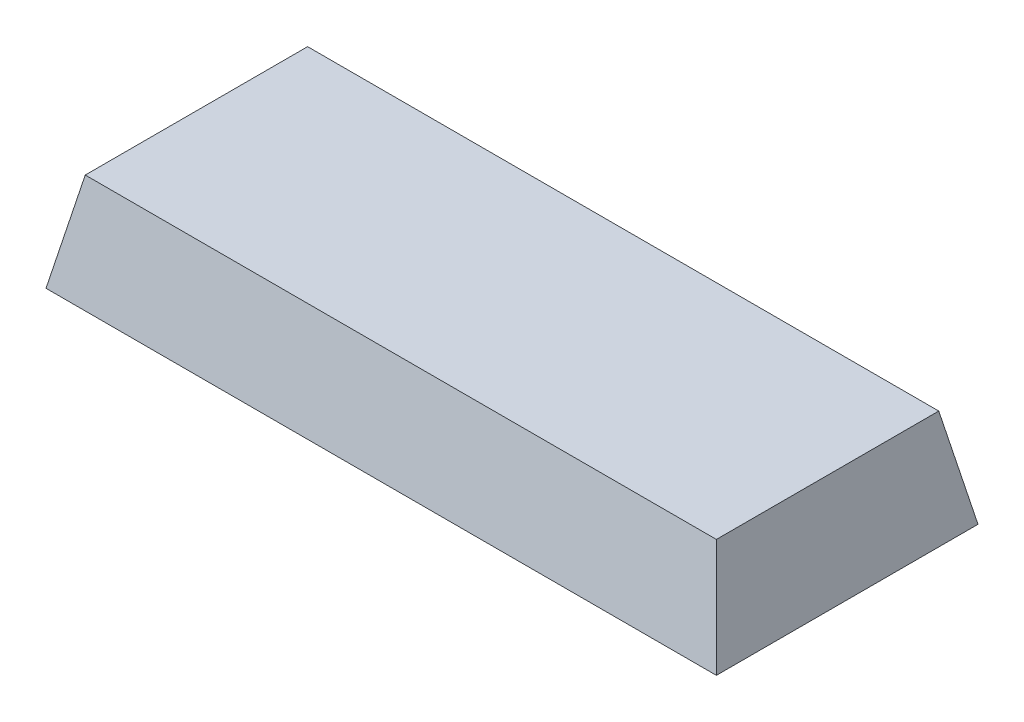
ISO-10303-21;
HEADER;
FILE_DESCRIPTION(('STEP AP214'),'2;1');
FILE_NAME('part.step','',(''),(''),'','','');
FILE_SCHEMA(('AUTOMOTIVE_DESIGN { 1 0 10303 214 1 1 1 1 }'));
ENDSEC;
DATA;
#1=APPLICATION_CONTEXT('core data for automotive mechanical design processes');
#2=APPLICATION_PROTOCOL_DEFINITION('international standard','automotive_design',2000,#1);
#3=PRODUCT_CONTEXT('',#1,'mechanical');
#4=PRODUCT('Part','Part','',(#3));
#5=PRODUCT_RELATED_PRODUCT_CATEGORY('part','',(#4));
#6=PRODUCT_DEFINITION_FORMATION('','',#4);
#7=PRODUCT_DEFINITION_CONTEXT('part definition',#1,'design');
#8=PRODUCT_DEFINITION('design','',#6,#7);
#9=PRODUCT_DEFINITION_SHAPE('','',#8);
#10=(LENGTH_UNIT() NAMED_UNIT(*) SI_UNIT(.MILLI.,.METRE.));
#11=(NAMED_UNIT(*) PLANE_ANGLE_UNIT() SI_UNIT($,.RADIAN.));
#12=(NAMED_UNIT(*) SI_UNIT($,.STERADIAN.) SOLID_ANGLE_UNIT());
#13=UNCERTAINTY_MEASURE_WITH_UNIT(LENGTH_MEASURE(1.E-05),#10,'distance_accuracy_value','');
#14=(GEOMETRIC_REPRESENTATION_CONTEXT(3) GLOBAL_UNCERTAINTY_ASSIGNED_CONTEXT((#13)) GLOBAL_UNIT_ASSIGNED_CONTEXT((#10,
#11,#12)) REPRESENTATION_CONTEXT('',''));
#15=CARTESIAN_POINT('',(0.,0.,0.));
#16=DIRECTION('',(0.,0.,1.));
#17=DIRECTION('',(1.,0.,0.));
#18=AXIS2_PLACEMENT_3D('',#15,#16,#17);
#19=CARTESIAN_POINT('',(0.,3.,0.));
#20=DIRECTION('',(0.,-1.,0.));
#21=DIRECTION('',(0.,0.,-1.));
#22=AXIS2_PLACEMENT_3D('',#19,#20,#21);
#23=PLANE('',#22);
#24=DIRECTION('',(-1.,0.,0.));
#25=VECTOR('',#24,1.);
#26=CARTESIAN_POINT('',(20.500055,3.,-0.6));
#27=LINE('',#26,#25);
#28=CARTESIAN_POINT('',(19.9,3.,-0.6));
#29=VERTEX_POINT('',#28);
#30=CARTESIAN_POINT('',(0.6,3.,-0.6));
#31=VERTEX_POINT('',#30);
#32=EDGE_CURVE('E144',#29,#31,#27,.T.);
#33=ORIENTED_EDGE('',*,*,#32,.F.);
#34=DIRECTION('',(0.,0.,1.));
#35=VECTOR('',#34,1.);
#36=CARTESIAN_POINT('',(19.9,3.,-8.));
#37=LINE('',#36,#35);
#38=CARTESIAN_POINT('',(19.9,3.,-7.4));
#39=VERTEX_POINT('',#38);
#40=EDGE_CURVE('E154',#39,#29,#37,.T.);
#41=ORIENTED_EDGE('',*,*,#40,.F.);
#42=DIRECTION('',(-1.,0.,0.));
#43=VECTOR('',#42,1.);
#44=CARTESIAN_POINT('',(20.500055,3.,-7.4));
#45=LINE('',#44,#43);
#46=CARTESIAN_POINT('',(0.599999999999998,3.,-7.4));
#47=VERTEX_POINT('',#46);
#48=EDGE_CURVE('E139',#39,#47,#45,.T.);
#49=ORIENTED_EDGE('',*,*,#48,.T.);
#50=DIRECTION('',(0.,0.,1.));
#51=VECTOR('',#50,1.);
#52=CARTESIAN_POINT('',(0.6,3.,-8.));
#53=LINE('',#52,#51);
#54=EDGE_CURVE('E160',#47,#31,#53,.T.);
#55=ORIENTED_EDGE('',*,*,#54,.T.);
#56=EDGE_LOOP('',(#33,#41,#49,#55));
#57=FACE_BOUND('',#56,.T.);
#58=ADVANCED_FACE('F42',(#57),#23,.F.);
#59=CARTESIAN_POINT('',(20.5,0.,-8.));
#60=DIRECTION('',(-0.98058067569092,-0.196116135138184,0.));
#61=DIRECTION('',(0.196116135138184,-0.98058067569092,0.));
#62=AXIS2_PLACEMENT_3D('',#59,#60,#61);
#63=PLANE('',#62);
#64=DIRECTION('',(-0.192450089729875,0.962250448649376,-0.192450089729875));
#65=VECTOR('',#64,1.);
#66=CARTESIAN_POINT('',(20.2037037037037,1.48148148148148,-0.296296296296295));
#67=LINE('',#66,#65);
#68=CARTESIAN_POINT('',(20.5000245,0.,0.));
#69=VERTEX_POINT('',#68);
#70=EDGE_CURVE('E151',#69,#29,#67,.T.);
#71=ORIENTED_EDGE('',*,*,#70,.F.);
#72=DIRECTION('',(0.,0.,-1.));
#73=VECTOR('',#72,1.);
#74=CARTESIAN_POINT('',(20.5,0.,0.));
#75=LINE('',#74,#73);
#76=CARTESIAN_POINT('',(20.5000025,0.,-8.));
#77=VERTEX_POINT('',#76);
#78=EDGE_CURVE('E179',#69,#77,#75,.T.);
#79=ORIENTED_EDGE('',*,*,#78,.T.);
#80=DIRECTION('',(0.192450089729875,-0.962250448649376,-0.192450089729875));
#81=VECTOR('',#80,1.);
#82=CARTESIAN_POINT('',(20.5,0.,-8.));
#83=LINE('',#82,#81);
#84=EDGE_CURVE('E147',#39,#77,#83,.T.);
#85=ORIENTED_EDGE('',*,*,#84,.F.);
#86=ORIENTED_EDGE('',*,*,#40,.T.);
#87=EDGE_LOOP('',(#71,#79,#85,#86));
#88=FACE_BOUND('',#87,.T.);
#89=ADVANCED_FACE('F219',(#88),#63,.F.);
#90=CARTESIAN_POINT('',(0.,0.,-8.));
#91=DIRECTION('',(0.98058067569092,-0.196116135138184,0.));
#92=DIRECTION('',(0.196116135138184,0.98058067569092,0.));
#93=AXIS2_PLACEMENT_3D('',#90,#91,#92);
#94=PLANE('',#93);
#95=DIRECTION('',(-0.192450089729875,-0.962250448649376,0.192450089729875));
#96=VECTOR('',#95,1.);
#97=CARTESIAN_POINT('',(0.296296296296296,1.48148148148148,-0.296296296296295));
#98=LINE('',#97,#96);
#99=CARTESIAN_POINT('',(-2.5E-06,0.,0.));
#100=VERTEX_POINT('',#99);
#101=EDGE_CURVE('E185',#31,#100,#98,.T.);
#102=ORIENTED_EDGE('',*,*,#101,.F.);
#103=ORIENTED_EDGE('',*,*,#54,.F.);
#104=DIRECTION('',(0.192450089729875,0.962250448649376,0.192450089729875));
#105=VECTOR('',#104,1.);
#106=CARTESIAN_POINT('',(0.,0.,-8.));
#107=LINE('',#106,#105);
#108=CARTESIAN_POINT('',(0.,0.,-8.));
#109=VERTEX_POINT('',#108);
#110=EDGE_CURVE('E170',#109,#47,#107,.T.);
#111=ORIENTED_EDGE('',*,*,#110,.F.);
#112=DIRECTION('',(0.,0.,1.));
#113=VECTOR('',#112,1.);
#114=CARTESIAN_POINT('',(0.,0.,0.));
#115=LINE('',#114,#113);
#116=EDGE_CURVE('E200',#109,#100,#115,.T.);
#117=ORIENTED_EDGE('',*,*,#116,.T.);
#118=EDGE_LOOP('',(#102,#103,#111,#117));
#119=FACE_BOUND('',#118,.T.);
#120=ADVANCED_FACE('F225',(#119),#94,.F.);
#121=CARTESIAN_POINT('',(0.,0.,0.));
#122=DIRECTION('',(0.,-1.,0.));
#123=DIRECTION('',(0.,0.,-1.));
#124=AXIS2_PLACEMENT_3D('',#121,#122,#123);
#125=PLANE('',#124);
#126=DIRECTION('',(0.,0.,-1.));
#127=VECTOR('',#126,1.);
#128=CARTESIAN_POINT('',(6.250011,0.,-8.));
#129=LINE('',#128,#127);
#130=CARTESIAN_POINT('',(6.250011,0.,-7.));
#131=VERTEX_POINT('',#130);
#132=CARTESIAN_POINT('',(6.250011,0.,-8.));
#133=VERTEX_POINT('',#132);
#134=EDGE_CURVE('E121',#131,#133,#129,.T.);
#135=ORIENTED_EDGE('',*,*,#134,.F.);
#136=DIRECTION('',(-1.,0.,0.));
#137=VECTOR('',#136,1.);
#138=CARTESIAN_POINT('',(6.250011,0.,-7.));
#139=LINE('',#138,#137);
#140=CARTESIAN_POINT('',(14.250011,0.,-7.));
#141=VERTEX_POINT('',#140);
#142=EDGE_CURVE('E109',#141,#131,#139,.T.);
#143=ORIENTED_EDGE('',*,*,#142,.F.);
#144=DIRECTION('',(0.,0.,1.));
#145=VECTOR('',#144,1.);
#146=CARTESIAN_POINT('',(14.250011,0.,-8.));
#147=LINE('',#146,#145);
#148=CARTESIAN_POINT('',(14.250011,0.,-8.));
#149=VERTEX_POINT('',#148);
#150=EDGE_CURVE('E117',#149,#141,#147,.T.);
#151=ORIENTED_EDGE('',*,*,#150,.F.);
#152=DIRECTION('',(-1.,0.,0.));
#153=VECTOR('',#152,1.);
#154=CARTESIAN_POINT('',(0.,0.,-8.));
#155=LINE('',#154,#153);
#156=EDGE_CURVE('E167',#77,#149,#155,.T.);
#157=ORIENTED_EDGE('',*,*,#156,.F.);
#158=ORIENTED_EDGE('',*,*,#78,.F.);
#159=DIRECTION('',(1.,0.,0.));
#160=VECTOR('',#159,1.);
#161=CARTESIAN_POINT('',(0.,0.,0.));
#162=LINE('',#161,#160);
#163=EDGE_CURVE('E356',#100,#69,#162,.T.);
#164=ORIENTED_EDGE('',*,*,#163,.F.);
#165=ORIENTED_EDGE('',*,*,#116,.F.);
#166=EDGE_CURVE('E171',#133,#109,#155,.T.);
#167=ORIENTED_EDGE('',*,*,#166,.F.);
#168=EDGE_LOOP('',(#135,#143,#151,#157,#158,#164,#165,#167));
#169=FACE_BOUND('',#168,.T.);
#170=CARTESIAN_POINT('',(10.25000125,0.,-3.75));
#171=DIRECTION('',(0.,-1.,0.));
#172=DIRECTION('',(0.,0.,-1.));
#173=AXIS2_PLACEMENT_3D('',#170,#171,#172);
#174=CIRCLE('',#173,1.8);
#175=CARTESIAN_POINT('',(10.25000125,0.,-5.55));
#176=VERTEX_POINT('',#175);
#177=EDGE_CURVE('E140',#176,#176,#174,.T.);
#178=ORIENTED_EDGE('',*,*,#177,.F.);
#179=EDGE_LOOP('',(#178));
#180=FACE_BOUND('',#179,.T.);
#181=ADVANCED_FACE('F114',(#169,#180),#125,.T.);
#182=CARTESIAN_POINT('',(20.500055,3.,-7.4));
#183=DIRECTION('',(0.,0.196116135138184,-0.98058067569092));
#184=DIRECTION('',(0.,0.98058067569092,0.196116135138184));
#185=AXIS2_PLACEMENT_3D('',#182,#183,#184);
#186=PLANE('',#185);
#187=ORIENTED_EDGE('',*,*,#84,.T.);
#188=ORIENTED_EDGE('',*,*,#156,.T.);
#189=DIRECTION('',(1.,0.,0.));
#190=VECTOR('',#189,1.);
#191=CARTESIAN_POINT('',(6.250011,0.,-8.));
#192=LINE('',#191,#190);
#193=EDGE_CURVE('E128',#133,#149,#192,.T.);
#194=ORIENTED_EDGE('',*,*,#193,.F.);
#195=ORIENTED_EDGE('',*,*,#166,.T.);
#196=ORIENTED_EDGE('',*,*,#110,.T.);
#197=ORIENTED_EDGE('',*,*,#48,.F.);
#198=EDGE_LOOP('',(#187,#188,#194,#195,#196,#197));
#199=FACE_BOUND('',#198,.T.);
#200=ADVANCED_FACE('F203',(#199),#186,.T.);
#201=CARTESIAN_POINT('',(20.500055,0.,0.));
#202=DIRECTION('',(0.,0.196116135138184,0.98058067569092));
#203=DIRECTION('',(0.,-0.98058067569092,0.196116135138184));
#204=AXIS2_PLACEMENT_3D('',#201,#202,#203);
#205=PLANE('',#204);
#206=ORIENTED_EDGE('',*,*,#70,.T.);
#207=ORIENTED_EDGE('',*,*,#32,.T.);
#208=ORIENTED_EDGE('',*,*,#101,.T.);
#209=ORIENTED_EDGE('',*,*,#163,.T.);
#210=EDGE_LOOP('',(#206,#207,#208,#209));
#211=FACE_BOUND('',#210,.T.);
#212=ADVANCED_FACE('F236',(#211),#205,.T.);
#213=CARTESIAN_POINT('',(10.25000125,0.8,-3.75));
#214=DIRECTION('',(0.,-1.,0.));
#215=DIRECTION('',(0.,0.,-1.));
#216=AXIS2_PLACEMENT_3D('',#213,#214,#215);
#217=CYLINDRICAL_SURFACE('',#216,1.8);
#218=CARTESIAN_POINT('',(10.25000125,0.8,-3.75));
#219=DIRECTION('',(0.,-1.,0.));
#220=DIRECTION('',(0.,0.,-1.));
#221=AXIS2_PLACEMENT_3D('',#218,#219,#220);
#222=CIRCLE('',#221,1.8);
#223=CARTESIAN_POINT('',(10.25000125,0.8,-5.55));
#224=VERTEX_POINT('',#223);
#225=EDGE_CURVE('E135',#224,#224,#222,.T.);
#226=ORIENTED_EDGE('',*,*,#225,.F.);
#227=EDGE_LOOP('',(#226));
#228=FACE_BOUND('',#227,.T.);
#229=ORIENTED_EDGE('',*,*,#177,.T.);
#230=EDGE_LOOP('',(#229));
#231=FACE_BOUND('',#230,.T.);
#232=ADVANCED_FACE('F245',(#228,#231),#217,.F.);
#233=CARTESIAN_POINT('',(10.25000125,0.8,-3.75));
#234=DIRECTION('',(0.,-1.,0.));
#235=DIRECTION('',(0.,0.,-1.));
#236=AXIS2_PLACEMENT_3D('',#233,#234,#235);
#237=PLANE('',#236);
#238=ORIENTED_EDGE('',*,*,#225,.T.);
#239=EDGE_LOOP('',(#238));
#240=FACE_BOUND('',#239,.T.);
#241=ADVANCED_FACE('F249',(#240),#237,.T.);
#242=CARTESIAN_POINT('',(6.250011,-2.,-8.));
#243=DIRECTION('',(0.,0.,1.));
#244=DIRECTION('',(1.,0.,0.));
#245=AXIS2_PLACEMENT_3D('',#242,#243,#244);
#246=PLANE('',#245);
#247=ORIENTED_EDGE('',*,*,#193,.T.);
#248=CARTESIAN_POINT('',(10.7859093848622,2.,-8.));
#249=DIRECTION('',(0.,0.,1.));
#250=DIRECTION('',(1.,0.,0.));
#251=AXIS2_PLACEMENT_3D('',#248,#249,#250);
#252=CIRCLE('',#251,4.);
#253=CARTESIAN_POINT('',(10.7859093848622,-2.,-8.));
#254=VERTEX_POINT('',#253);
#255=EDGE_CURVE('E11',#149,#254,#252,.F.);
#256=ORIENTED_EDGE('',*,*,#255,.T.);
#257=DIRECTION('',(1.,0.,0.));
#258=VECTOR('',#257,1.);
#259=CARTESIAN_POINT('',(6.250011,-2.,-8.));
#260=LINE('',#259,#258);
#261=CARTESIAN_POINT('',(9.71411261513775,-2.,-8.));
#262=VERTEX_POINT('',#261);
#263=EDGE_CURVE('E123',#262,#254,#260,.T.);
#264=ORIENTED_EDGE('',*,*,#263,.F.);
#265=CARTESIAN_POINT('',(9.71411261513775,2.,-8.));
#266=DIRECTION('',(0.,0.,1.));
#267=DIRECTION('',(1.,0.,0.));
#268=AXIS2_PLACEMENT_3D('',#265,#266,#267);
#269=CIRCLE('',#268,4.);
#270=EDGE_CURVE('E51',#262,#133,#269,.F.);
#271=ORIENTED_EDGE('',*,*,#270,.T.);
#272=EDGE_LOOP('',(#247,#256,#264,#271));
#273=FACE_BOUND('',#272,.T.);
#274=ADVANCED_FACE('F192',(#273),#246,.F.);
#275=CARTESIAN_POINT('',(6.250011,-2.,-7.));
#276=DIRECTION('',(0.,0.,-1.));
#277=DIRECTION('',(-1.,0.,0.));
#278=AXIS2_PLACEMENT_3D('',#275,#276,#277);
#279=PLANE('',#278);
#280=DIRECTION('',(-1.,0.,0.));
#281=VECTOR('',#280,1.);
#282=CARTESIAN_POINT('',(6.250011,-2.,-7.));
#283=LINE('',#282,#281);
#284=CARTESIAN_POINT('',(10.7859093848622,-2.,-7.));
#285=VERTEX_POINT('',#284);
#286=CARTESIAN_POINT('',(9.71411261513775,-2.,-7.));
#287=VERTEX_POINT('',#286);
#288=EDGE_CURVE('E110',#285,#287,#283,.T.);
#289=ORIENTED_EDGE('',*,*,#288,.F.);
#290=CARTESIAN_POINT('',(10.7859093848622,2.,-7.));
#291=DIRECTION('',(0.,0.,-1.));
#292=DIRECTION('',(-1.,0.,0.));
#293=AXIS2_PLACEMENT_3D('',#290,#291,#292);
#294=CIRCLE('',#293,4.);
#295=EDGE_CURVE('E66',#285,#141,#294,.F.);
#296=ORIENTED_EDGE('',*,*,#295,.T.);
#297=ORIENTED_EDGE('',*,*,#142,.T.);
#298=CARTESIAN_POINT('',(9.71411261513775,2.,-7.));
#299=DIRECTION('',(0.,0.,-1.));
#300=DIRECTION('',(-1.,0.,0.));
#301=AXIS2_PLACEMENT_3D('',#298,#299,#300);
#302=CIRCLE('',#301,4.);
#303=EDGE_CURVE('E58',#131,#287,#302,.F.);
#304=ORIENTED_EDGE('',*,*,#303,.T.);
#305=EDGE_LOOP('',(#289,#296,#297,#304));
#306=FACE_BOUND('',#305,.T.);
#307=ADVANCED_FACE('F108',(#306),#279,.F.);
#308=CARTESIAN_POINT('',(0.,-2.,0.));
#309=DIRECTION('',(0.,1.,0.));
#310=DIRECTION('',(0.,0.,1.));
#311=AXIS2_PLACEMENT_3D('',#308,#309,#310);
#312=PLANE('',#311);
#313=ORIENTED_EDGE('',*,*,#263,.T.);
#314=DIRECTION('',(0.,0.,1.));
#315=VECTOR('',#314,1.);
#316=CARTESIAN_POINT('',(10.7859093848623,-2.,0.));
#317=LINE('',#316,#315);
#318=EDGE_CURVE('E184',#254,#285,#317,.T.);
#319=ORIENTED_EDGE('',*,*,#318,.T.);
#320=ORIENTED_EDGE('',*,*,#288,.T.);
#321=DIRECTION('',(0.,0.,-1.));
#322=VECTOR('',#321,1.);
#323=CARTESIAN_POINT('',(9.71411261513775,-2.,0.));
#324=LINE('',#323,#322);
#325=EDGE_CURVE('E180',#287,#262,#324,.T.);
#326=ORIENTED_EDGE('',*,*,#325,.T.);
#327=EDGE_LOOP('',(#313,#319,#320,#326));
#328=FACE_BOUND('',#327,.T.);
#329=ADVANCED_FACE('F210',(#328),#312,.F.);
#330=CARTESIAN_POINT('',(10.7859093848622,2.,-7.99999999999999));
#331=DIRECTION('',(0.,0.,1.));
#332=DIRECTION('',(1.,0.,0.));
#333=AXIS2_PLACEMENT_3D('',#330,#331,#332);
#334=CYLINDRICAL_SURFACE('',#333,4.);
#335=ORIENTED_EDGE('',*,*,#255,.F.);
#336=ORIENTED_EDGE('',*,*,#150,.T.);
#337=ORIENTED_EDGE('',*,*,#295,.F.);
#338=ORIENTED_EDGE('',*,*,#318,.F.);
#339=EDGE_LOOP('',(#335,#336,#337,#338));
#340=FACE_BOUND('',#339,.T.);
#341=ADVANCED_FACE('F126',(#340),#334,.T.);
#342=CARTESIAN_POINT('',(9.71411261513775,2.,-8.));
#343=DIRECTION('',(0.,0.,-1.));
#344=DIRECTION('',(-1.,0.,0.));
#345=AXIS2_PLACEMENT_3D('',#342,#343,#344);
#346=CYLINDRICAL_SURFACE('',#345,4.);
#347=ORIENTED_EDGE('',*,*,#303,.F.);
#348=ORIENTED_EDGE('',*,*,#134,.T.);
#349=ORIENTED_EDGE('',*,*,#270,.F.);
#350=ORIENTED_EDGE('',*,*,#325,.F.);
#351=EDGE_LOOP('',(#347,#348,#349,#350));
#352=FACE_BOUND('',#351,.T.);
#353=ADVANCED_FACE('F44',(#352),#346,.T.);
#354=CLOSED_SHELL('',(#58,#89,#120,#181,#200,#212,#232,#241,#274,#307,#329,#341,#353));
#355=MANIFOLD_SOLID_BREP('B2',#354);
#356=ADVANCED_BREP_SHAPE_REPRESENTATION('',(#18,#355),#14);
#357=SHAPE_DEFINITION_REPRESENTATION(#9,#356);
ENDSEC;
END-ISO-10303-21;
